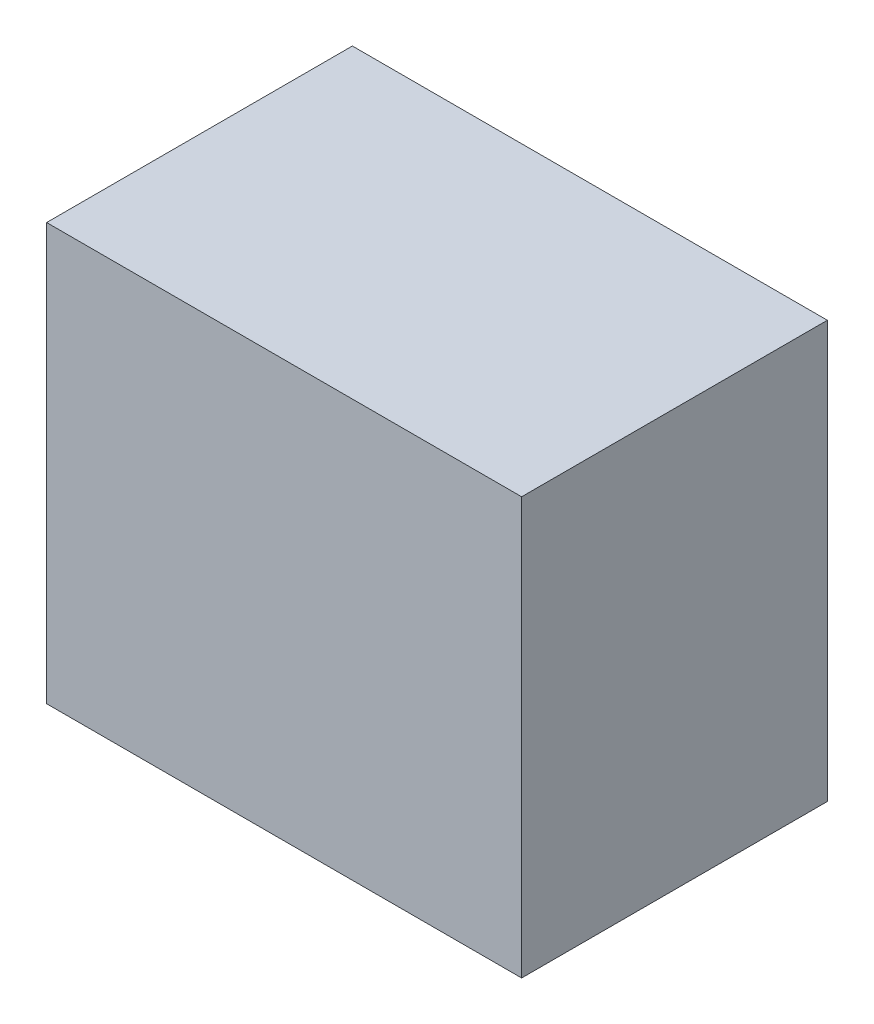
ISO-10303-21;
HEADER;
FILE_DESCRIPTION(('STEP AP214'),'2;1');
FILE_NAME('part.step','',(''),(''),'','','');
FILE_SCHEMA(('AUTOMOTIVE_DESIGN { 1 0 10303 214 1 1 1 1 }'));
ENDSEC;
DATA;
#1=APPLICATION_CONTEXT('core data for automotive mechanical design processes');
#2=APPLICATION_PROTOCOL_DEFINITION('international standard','automotive_design',2000,#1);
#3=PRODUCT_CONTEXT('',#1,'mechanical');
#4=PRODUCT('Part','Part','',(#3));
#5=PRODUCT_RELATED_PRODUCT_CATEGORY('part','',(#4));
#6=PRODUCT_DEFINITION_FORMATION('','',#4);
#7=PRODUCT_DEFINITION_CONTEXT('part definition',#1,'design');
#8=PRODUCT_DEFINITION('design','',#6,#7);
#9=PRODUCT_DEFINITION_SHAPE('','',#8);
#10=(LENGTH_UNIT() NAMED_UNIT(*) SI_UNIT(.MILLI.,.METRE.));
#11=(NAMED_UNIT(*) PLANE_ANGLE_UNIT() SI_UNIT($,.RADIAN.));
#12=(NAMED_UNIT(*) SI_UNIT($,.STERADIAN.) SOLID_ANGLE_UNIT());
#13=UNCERTAINTY_MEASURE_WITH_UNIT(LENGTH_MEASURE(1.E-05),#10,'distance_accuracy_value','');
#14=(GEOMETRIC_REPRESENTATION_CONTEXT(3) GLOBAL_UNCERTAINTY_ASSIGNED_CONTEXT((#13)) GLOBAL_UNIT_ASSIGNED_CONTEXT((#10,
#11,#12)) REPRESENTATION_CONTEXT('',''));
#15=CARTESIAN_POINT('',(0.,0.,0.));
#16=DIRECTION('',(0.,0.,1.));
#17=DIRECTION('',(1.,0.,0.));
#18=AXIS2_PLACEMENT_3D('',#15,#16,#17);
#19=CARTESIAN_POINT('',(3.2258,4.1148,14.));
#20=DIRECTION('',(0.,0.,-1.));
#21=DIRECTION('',(-1.,0.,0.));
#22=AXIS2_PLACEMENT_3D('',#19,#20,#21);
#23=PLANE('',#22);
#24=DIRECTION('',(0.,1.,0.));
#25=VECTOR('',#24,1.);
#26=CARTESIAN_POINT('',(-15.4178,4.1148,14.));
#27=LINE('',#26,#25);
#28=CARTESIAN_POINT('',(-15.4178,4.1148,14.));
#29=VERTEX_POINT('',#28);
#30=CARTESIAN_POINT('',(-15.4178,-12.2428,14.));
#31=VERTEX_POINT('',#30);
#32=EDGE_CURVE('E55',#29,#31,#27,.F.);
#33=ORIENTED_EDGE('',*,*,#32,.T.);
#34=DIRECTION('',(1.,0.,0.));
#35=VECTOR('',#34,1.);
#36=CARTESIAN_POINT('',(-15.4178,-12.2428,14.));
#37=LINE('',#36,#35);
#38=CARTESIAN_POINT('',(3.2258,-12.2428,14.));
#39=VERTEX_POINT('',#38);
#40=EDGE_CURVE('E57',#31,#39,#37,.T.);
#41=ORIENTED_EDGE('',*,*,#40,.T.);
#42=DIRECTION('',(0.,1.,0.));
#43=VECTOR('',#42,1.);
#44=CARTESIAN_POINT('',(3.2258,-12.2428,14.));
#45=LINE('',#44,#43);
#46=CARTESIAN_POINT('',(3.2258,4.1148,14.));
#47=VERTEX_POINT('',#46);
#48=EDGE_CURVE('E20',#39,#47,#45,.T.);
#49=ORIENTED_EDGE('',*,*,#48,.T.);
#50=DIRECTION('',(1.,0.,0.));
#51=VECTOR('',#50,1.);
#52=CARTESIAN_POINT('',(3.2258,4.1148,14.));
#53=LINE('',#52,#51);
#54=EDGE_CURVE('E80',#47,#29,#53,.F.);
#55=ORIENTED_EDGE('',*,*,#54,.T.);
#56=EDGE_LOOP('',(#33,#41,#49,#55));
#57=FACE_BOUND('',#56,.T.);
#58=ADVANCED_FACE('F17',(#57),#23,.F.);
#59=CARTESIAN_POINT('',(3.2258,-12.2428,2.));
#60=DIRECTION('',(-1.,0.,0.));
#61=DIRECTION('',(0.,0.,1.));
#62=AXIS2_PLACEMENT_3D('',#59,#60,#61);
#63=PLANE('',#62);
#64=DIRECTION('',(0.,0.,-1.));
#65=VECTOR('',#64,1.);
#66=CARTESIAN_POINT('',(3.2258,4.1148,2.));
#67=LINE('',#66,#65);
#68=CARTESIAN_POINT('',(3.2258,4.1148,2.));
#69=VERTEX_POINT('',#68);
#70=EDGE_CURVE('E68',#69,#47,#67,.F.);
#71=ORIENTED_EDGE('',*,*,#70,.T.);
#72=ORIENTED_EDGE('',*,*,#48,.F.);
#73=DIRECTION('',(0.,0.,1.));
#74=VECTOR('',#73,1.);
#75=CARTESIAN_POINT('',(3.2258,-12.2428,2.));
#76=LINE('',#75,#74);
#77=CARTESIAN_POINT('',(3.2258,-12.2428,2.));
#78=VERTEX_POINT('',#77);
#79=EDGE_CURVE('E63',#39,#78,#76,.F.);
#80=ORIENTED_EDGE('',*,*,#79,.T.);
#81=DIRECTION('',(0.,1.,0.));
#82=VECTOR('',#81,1.);
#83=CARTESIAN_POINT('',(3.2258,4.1148,2.));
#84=LINE('',#83,#82);
#85=EDGE_CURVE('E83',#69,#78,#84,.F.);
#86=ORIENTED_EDGE('',*,*,#85,.F.);
#87=EDGE_LOOP('',(#71,#72,#80,#86));
#88=FACE_BOUND('',#87,.T.);
#89=ADVANCED_FACE('F65',(#88),#63,.F.);
#90=CARTESIAN_POINT('',(-15.4178,-12.2428,2.));
#91=DIRECTION('',(0.,1.,0.));
#92=DIRECTION('',(0.,0.,1.));
#93=AXIS2_PLACEMENT_3D('',#90,#91,#92);
#94=PLANE('',#93);
#95=ORIENTED_EDGE('',*,*,#79,.F.);
#96=ORIENTED_EDGE('',*,*,#40,.F.);
#97=DIRECTION('',(0.,0.,-1.));
#98=VECTOR('',#97,1.);
#99=CARTESIAN_POINT('',(-15.4178,-12.2428,2.));
#100=LINE('',#99,#98);
#101=CARTESIAN_POINT('',(-15.4178,-12.2428,2.));
#102=VERTEX_POINT('',#101);
#103=EDGE_CURVE('E75',#31,#102,#100,.T.);
#104=ORIENTED_EDGE('',*,*,#103,.T.);
#105=DIRECTION('',(-1.,0.,0.));
#106=VECTOR('',#105,1.);
#107=CARTESIAN_POINT('',(3.2258,-12.2428,2.));
#108=LINE('',#107,#106);
#109=EDGE_CURVE('E72',#78,#102,#108,.T.);
#110=ORIENTED_EDGE('',*,*,#109,.F.);
#111=EDGE_LOOP('',(#95,#96,#104,#110));
#112=FACE_BOUND('',#111,.T.);
#113=ADVANCED_FACE('F70',(#112),#94,.F.);
#114=CARTESIAN_POINT('',(-15.4178,4.1148,2.));
#115=DIRECTION('',(1.,0.,0.));
#116=DIRECTION('',(0.,0.,-1.));
#117=AXIS2_PLACEMENT_3D('',#114,#115,#116);
#118=PLANE('',#117);
#119=ORIENTED_EDGE('',*,*,#103,.F.);
#120=ORIENTED_EDGE('',*,*,#32,.F.);
#121=DIRECTION('',(0.,0.,-1.));
#122=VECTOR('',#121,1.);
#123=CARTESIAN_POINT('',(-15.4178,4.1148,2.));
#124=LINE('',#123,#122);
#125=CARTESIAN_POINT('',(-15.4178,4.1148,2.));
#126=VERTEX_POINT('',#125);
#127=EDGE_CURVE('E35',#29,#126,#124,.T.);
#128=ORIENTED_EDGE('',*,*,#127,.T.);
#129=DIRECTION('',(0.,1.,0.));
#130=VECTOR('',#129,1.);
#131=CARTESIAN_POINT('',(-15.4178,4.1148,2.));
#132=LINE('',#131,#130);
#133=EDGE_CURVE('E26',#102,#126,#132,.T.);
#134=ORIENTED_EDGE('',*,*,#133,.F.);
#135=EDGE_LOOP('',(#119,#120,#128,#134));
#136=FACE_BOUND('',#135,.T.);
#137=ADVANCED_FACE('F89',(#136),#118,.F.);
#138=CARTESIAN_POINT('',(3.2258,4.1148,2.));
#139=DIRECTION('',(0.,-1.,0.));
#140=DIRECTION('',(0.,0.,-1.));
#141=AXIS2_PLACEMENT_3D('',#138,#139,#140);
#142=PLANE('',#141);
#143=ORIENTED_EDGE('',*,*,#127,.F.);
#144=ORIENTED_EDGE('',*,*,#54,.F.);
#145=ORIENTED_EDGE('',*,*,#70,.F.);
#146=DIRECTION('',(-1.,0.,0.));
#147=VECTOR('',#146,1.);
#148=CARTESIAN_POINT('',(3.2258,4.1148,2.));
#149=LINE('',#148,#147);
#150=EDGE_CURVE('E11',#126,#69,#149,.F.);
#151=ORIENTED_EDGE('',*,*,#150,.F.);
#152=EDGE_LOOP('',(#143,#144,#145,#151));
#153=FACE_BOUND('',#152,.T.);
#154=ADVANCED_FACE('F91',(#153),#142,.F.);
#155=CARTESIAN_POINT('',(3.2258,4.1148,2.));
#156=DIRECTION('',(0.,0.,-1.));
#157=DIRECTION('',(-1.,0.,0.));
#158=AXIS2_PLACEMENT_3D('',#155,#156,#157);
#159=PLANE('',#158);
#160=ORIENTED_EDGE('',*,*,#133,.T.);
#161=ORIENTED_EDGE('',*,*,#150,.T.);
#162=ORIENTED_EDGE('',*,*,#85,.T.);
#163=ORIENTED_EDGE('',*,*,#109,.T.);
#164=EDGE_LOOP('',(#160,#161,#162,#163));
#165=FACE_BOUND('',#164,.T.);
#166=ADVANCED_FACE('F88',(#165),#159,.T.);
#167=CLOSED_SHELL('',(#58,#89,#113,#137,#154,#166));
#168=MANIFOLD_SOLID_BREP('B1',#167);
#169=ADVANCED_BREP_SHAPE_REPRESENTATION('',(#18,#168),#14);
#170=SHAPE_DEFINITION_REPRESENTATION(#9,#169);
ENDSEC;
END-ISO-10303-21;
